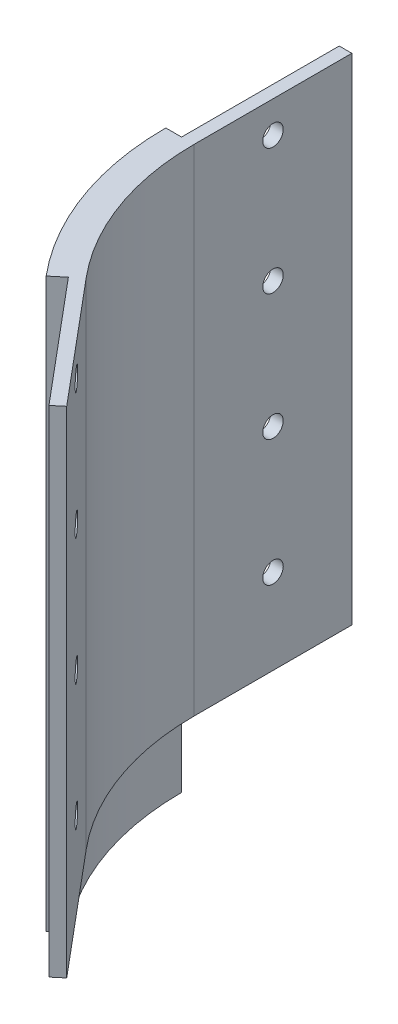
ISO-10303-21;
HEADER;
FILE_DESCRIPTION(('STEP AP214'),'2;1');
FILE_NAME('part.step','',(''),(''),'','','');
FILE_SCHEMA(('AUTOMOTIVE_DESIGN { 1 0 10303 214 1 1 1 1 }'));
ENDSEC;
DATA;
#1=APPLICATION_CONTEXT('core data for automotive mechanical design processes');
#2=APPLICATION_PROTOCOL_DEFINITION('international standard','automotive_design',2000,#1);
#3=PRODUCT_CONTEXT('',#1,'mechanical');
#4=PRODUCT('Part','Part','',(#3));
#5=PRODUCT_RELATED_PRODUCT_CATEGORY('part','',(#4));
#6=PRODUCT_DEFINITION_FORMATION('','',#4);
#7=PRODUCT_DEFINITION_CONTEXT('part definition',#1,'design');
#8=PRODUCT_DEFINITION('design','',#6,#7);
#9=PRODUCT_DEFINITION_SHAPE('','',#8);
#10=(LENGTH_UNIT() NAMED_UNIT(*) SI_UNIT(.MILLI.,.METRE.));
#11=(NAMED_UNIT(*) PLANE_ANGLE_UNIT() SI_UNIT($,.RADIAN.));
#12=(NAMED_UNIT(*) SI_UNIT($,.STERADIAN.) SOLID_ANGLE_UNIT());
#13=UNCERTAINTY_MEASURE_WITH_UNIT(LENGTH_MEASURE(1.E-05),#10,'distance_accuracy_value','');
#14=(GEOMETRIC_REPRESENTATION_CONTEXT(3) GLOBAL_UNCERTAINTY_ASSIGNED_CONTEXT((#13)) GLOBAL_UNIT_ASSIGNED_CONTEXT((#10,
#11,#12)) REPRESENTATION_CONTEXT('',''));
#15=CARTESIAN_POINT('',(0.,0.,0.));
#16=DIRECTION('',(0.,0.,1.));
#17=DIRECTION('',(1.,0.,0.));
#18=AXIS2_PLACEMENT_3D('',#15,#16,#17);
#19=CARTESIAN_POINT('',(6.70784506652562,200.,59.6418141452981));
#20=DIRECTION('',(-0.64278760968654,0.,-0.766044443118977));
#21=DIRECTION('',(0.766044443118978,0.,-0.64278760968654));
#22=AXIS2_PLACEMENT_3D('',#19,#20,#21);
#23=PLANE('',#22);
#24=DIRECTION('',(-0.766044443118977,0.,0.64278760968654));
#25=VECTOR('',#24,1.);
#26=CARTESIAN_POINT('',(6.70784506652562,20.,59.6418141452981));
#27=LINE('',#26,#25);
#28=CARTESIAN_POINT('',(10.5380672821205,20.,56.4278760968654));
#29=VERTEX_POINT('',#28);
#30=CARTESIAN_POINT('',(6.70784506652562,20.,59.6418141452981));
#31=VERTEX_POINT('',#30);
#32=EDGE_CURVE('E149',#29,#31,#27,.T.);
#33=ORIENTED_EDGE('',*,*,#32,.F.);
#34=DIRECTION('',(0.,-1.,0.));
#35=VECTOR('',#34,1.);
#36=CARTESIAN_POINT('',(10.5380672821205,43.,56.4278760968654));
#37=LINE('',#36,#35);
#38=CARTESIAN_POINT('',(10.5380672821205,43.0000000000001,56.4278760968654));
#39=VERTEX_POINT('',#38);
#40=EDGE_CURVE('E169',#39,#29,#37,.T.);
#41=ORIENTED_EDGE('',*,*,#40,.F.);
#42=DIRECTION('',(0.,-1.,0.));
#43=VECTOR('',#42,1.);
#44=CARTESIAN_POINT('',(10.5380672821205,200.,56.4278760968654));
#45=LINE('',#44,#43);
#46=CARTESIAN_POINT('',(10.5380672821205,200.,56.4278760968654));
#47=VERTEX_POINT('',#46);
#48=EDGE_CURVE('E11',#47,#39,#45,.T.);
#49=ORIENTED_EDGE('',*,*,#48,.F.);
#50=DIRECTION('',(-0.766044443118977,0.,0.64278760968654));
#51=VECTOR('',#50,1.);
#52=CARTESIAN_POINT('',(6.70784506652562,200.,59.6418141452981));
#53=LINE('',#52,#51);
#54=CARTESIAN_POINT('',(6.70784506652562,200.,59.6418141452981));
#55=VERTEX_POINT('',#54);
#56=EDGE_CURVE('E235',#47,#55,#53,.T.);
#57=ORIENTED_EDGE('',*,*,#56,.T.);
#58=DIRECTION('',(0.,-1.,0.));
#59=VECTOR('',#58,1.);
#60=CARTESIAN_POINT('',(6.70784506652562,200.,59.6418141452981));
#61=LINE('',#60,#59);
#62=EDGE_CURVE('E47',#55,#31,#61,.T.);
#63=ORIENTED_EDGE('',*,*,#62,.T.);
#64=EDGE_LOOP('',(#33,#41,#49,#57,#63));
#65=FACE_BOUND('',#64,.T.);
#66=ADVANCED_FACE('F39',(#65),#23,.F.);
#67=CARTESIAN_POINT('',(77.7861913430201,200.,0.));
#68=DIRECTION('',(0.,-1.,0.));
#69=DIRECTION('',(0.,0.,1.));
#70=AXIS2_PLACEMENT_3D('',#67,#68,#69);
#71=CYLINDRICAL_SURFACE('',#70,92.7861913430201);
#72=CARTESIAN_POINT('',(77.7861913430201,20.,0.));
#73=DIRECTION('',(0.,-1.,0.));
#74=DIRECTION('',(0.,0.,-1.));
#75=AXIS2_PLACEMENT_3D('',#72,#73,#74);
#76=CIRCLE('',#75,92.7861913430201);
#77=CARTESIAN_POINT('',(-15.,20.,0.));
#78=VERTEX_POINT('',#77);
#79=EDGE_CURVE('E247',#31,#78,#76,.T.);
#80=ORIENTED_EDGE('',*,*,#79,.F.);
#81=ORIENTED_EDGE('',*,*,#62,.F.);
#82=CARTESIAN_POINT('',(77.7861913430201,200.,0.));
#83=DIRECTION('',(0.,-1.,0.));
#84=DIRECTION('',(0.,0.,-1.));
#85=AXIS2_PLACEMENT_3D('',#82,#83,#84);
#86=CIRCLE('',#85,92.7861913430201);
#87=CARTESIAN_POINT('',(-15.,200.,0.));
#88=VERTEX_POINT('',#87);
#89=EDGE_CURVE('E238',#55,#88,#86,.T.);
#90=ORIENTED_EDGE('',*,*,#89,.T.);
#91=DIRECTION('',(0.,-1.,0.));
#92=VECTOR('',#91,1.);
#93=CARTESIAN_POINT('',(-15.,200.,0.));
#94=LINE('',#93,#92);
#95=EDGE_CURVE('E253',#88,#78,#94,.T.);
#96=ORIENTED_EDGE('',*,*,#95,.T.);
#97=EDGE_LOOP('',(#80,#81,#90,#96));
#98=FACE_BOUND('',#97,.T.);
#99=ADVANCED_FACE('F300',(#98),#71,.T.);
#100=CARTESIAN_POINT('',(-15.,200.,0.));
#101=DIRECTION('',(0.,0.,1.));
#102=DIRECTION('',(-1.,0.,0.));
#103=AXIS2_PLACEMENT_3D('',#100,#101,#102);
#104=PLANE('',#103);
#105=DIRECTION('',(1.,0.,0.));
#106=VECTOR('',#105,1.);
#107=CARTESIAN_POINT('',(-15.,20.,0.));
#108=LINE('',#107,#106);
#109=CARTESIAN_POINT('',(-9.99999999999999,20.,0.));
#110=VERTEX_POINT('',#109);
#111=EDGE_CURVE('E80',#78,#110,#108,.T.);
#112=ORIENTED_EDGE('',*,*,#111,.F.);
#113=ORIENTED_EDGE('',*,*,#95,.F.);
#114=DIRECTION('',(1.,0.,0.));
#115=VECTOR('',#114,1.);
#116=CARTESIAN_POINT('',(-15.,200.,0.));
#117=LINE('',#116,#115);
#118=CARTESIAN_POINT('',(-9.99999999999999,200.,0.));
#119=VERTEX_POINT('',#118);
#120=EDGE_CURVE('E241',#88,#119,#117,.T.);
#121=ORIENTED_EDGE('',*,*,#120,.T.);
#122=DIRECTION('',(0.,-1.,0.));
#123=VECTOR('',#122,1.);
#124=CARTESIAN_POINT('',(-9.99999999999999,200.,0.));
#125=LINE('',#124,#123);
#126=CARTESIAN_POINT('',(-9.99999999999999,43.,0.));
#127=VERTEX_POINT('',#126);
#128=EDGE_CURVE('E244',#119,#127,#125,.T.);
#129=ORIENTED_EDGE('',*,*,#128,.T.);
#130=DIRECTION('',(0.,-1.,0.));
#131=VECTOR('',#130,1.);
#132=CARTESIAN_POINT('',(-9.99999999999999,43.,0.));
#133=LINE('',#132,#131);
#134=EDGE_CURVE('E172',#127,#110,#133,.T.);
#135=ORIENTED_EDGE('',*,*,#134,.T.);
#136=EDGE_LOOP('',(#112,#113,#121,#129,#135));
#137=FACE_BOUND('',#136,.T.);
#138=ADVANCED_FACE('F297',(#137),#104,.F.);
#139=CARTESIAN_POINT('',(77.7861913430201,200.,0.));
#140=DIRECTION('',(0.,1.,0.));
#141=DIRECTION('',(0.,0.,-1.));
#142=AXIS2_PLACEMENT_3D('',#139,#140,#141);
#143=PLANE('',#142);
#144=ORIENTED_EDGE('',*,*,#120,.F.);
#145=ORIENTED_EDGE('',*,*,#89,.F.);
#146=ORIENTED_EDGE('',*,*,#56,.F.);
#147=DIRECTION('',(-0.642787609686543,0.,-0.766044443118975));
#148=VECTOR('',#147,1.);
#149=CARTESIAN_POINT('',(-21.6013132022066,200.,18.1256539409167));
#150=LINE('',#149,#148);
#151=CARTESIAN_POINT('',(42.6774477664477,200.,94.7300982528141));
#152=VERTEX_POINT('',#151);
#153=EDGE_CURVE('E87',#152,#47,#150,.T.);
#154=ORIENTED_EDGE('',*,*,#153,.F.);
#155=DIRECTION('',(-0.766044443118976,0.,0.642787609686542));
#156=VECTOR('',#155,1.);
#157=CARTESIAN_POINT('',(64.2787609686542,200.,76.6044443118976));
#158=LINE('',#157,#156);
#159=CARTESIAN_POINT('',(45.7416255389236,200.,92.158947814068));
#160=VERTEX_POINT('',#159);
#161=EDGE_CURVE('E148',#160,#152,#158,.T.);
#162=ORIENTED_EDGE('',*,*,#161,.F.);
#163=DIRECTION('',(0.642787609686543,0.,0.766044443118975));
#164=VECTOR('',#163,1.);
#165=CARTESIAN_POINT('',(-18.5371354297307,200.,15.5545035021705));
#166=LINE('',#165,#164);
#167=CARTESIAN_POINT('',(13.6022450545964,200.,53.8567256581192));
#168=VERTEX_POINT('',#167);
#169=EDGE_CURVE('E221',#168,#160,#166,.T.);
#170=ORIENTED_EDGE('',*,*,#169,.F.);
#171=CARTESIAN_POINT('',(77.7861913430201,200.,0.));
#172=DIRECTION('',(0.,-1.,0.));
#173=DIRECTION('',(0.,0.,-1.));
#174=AXIS2_PLACEMENT_3D('',#171,#172,#173);
#175=CIRCLE('',#174,83.7861913430201);
#176=CARTESIAN_POINT('',(-5.99999999999999,200.,0.));
#177=VERTEX_POINT('',#176);
#178=EDGE_CURVE('E218',#168,#177,#175,.T.);
#179=ORIENTED_EDGE('',*,*,#178,.T.);
#180=DIRECTION('',(0.,0.,-1.));
#181=VECTOR('',#180,1.);
#182=CARTESIAN_POINT('',(-5.99999999999999,200.,0.));
#183=LINE('',#182,#181);
#184=CARTESIAN_POINT('',(-6.00000000000002,200.,-50.));
#185=VERTEX_POINT('',#184);
#186=EDGE_CURVE('E215',#177,#185,#183,.T.);
#187=ORIENTED_EDGE('',*,*,#186,.T.);
#188=DIRECTION('',(-1.,0.,0.));
#189=VECTOR('',#188,1.);
#190=CARTESIAN_POINT('',(1.73472347597681E-13,200.,-49.9999999999999));
#191=LINE('',#190,#189);
#192=CARTESIAN_POINT('',(-10.,200.,-50.));
#193=VERTEX_POINT('',#192);
#194=EDGE_CURVE('E213',#185,#193,#191,.T.);
#195=ORIENTED_EDGE('',*,*,#194,.T.);
#196=DIRECTION('',(0.,0.,1.));
#197=VECTOR('',#196,1.);
#198=CARTESIAN_POINT('',(-10.,200.,0.));
#199=LINE('',#198,#197);
#200=EDGE_CURVE('E64',#193,#119,#199,.T.);
#201=ORIENTED_EDGE('',*,*,#200,.T.);
#202=EDGE_LOOP('',(#144,#145,#146,#154,#162,#170,#179,#187,#195,#201));
#203=FACE_BOUND('',#202,.T.);
#204=ADVANCED_FACE('F289',(#203),#143,.T.);
#205=CARTESIAN_POINT('',(77.7861913430201,20.,0.));
#206=DIRECTION('',(0.,1.,0.));
#207=DIRECTION('',(0.,0.,-1.));
#208=AXIS2_PLACEMENT_3D('',#205,#206,#207);
#209=PLANE('',#208);
#210=ORIENTED_EDGE('',*,*,#32,.T.);
#211=ORIENTED_EDGE('',*,*,#79,.T.);
#212=ORIENTED_EDGE('',*,*,#111,.T.);
#213=CARTESIAN_POINT('',(77.7861913430202,20.,0.));
#214=DIRECTION('',(0.,1.,0.));
#215=DIRECTION('',(0.,0.,-1.));
#216=AXIS2_PLACEMENT_3D('',#213,#214,#215);
#217=CIRCLE('',#216,87.7861913430202);
#218=EDGE_CURVE('E170',#110,#29,#217,.T.);
#219=ORIENTED_EDGE('',*,*,#218,.T.);
#220=EDGE_LOOP('',(#210,#211,#212,#219));
#221=FACE_BOUND('',#220,.T.);
#222=ADVANCED_FACE('F305',(#221),#209,.F.);
#223=CARTESIAN_POINT('',(-10.,-135.093295013004,0.));
#224=DIRECTION('',(1.,0.,0.));
#225=DIRECTION('',(0.,0.,1.));
#226=AXIS2_PLACEMENT_3D('',#223,#224,#225);
#227=PLANE('',#226);
#228=CARTESIAN_POINT('',(-10.,190.,-25.));
#229=DIRECTION('',(1.,0.,0.));
#230=DIRECTION('',(0.,0.,-1.));
#231=AXIS2_PLACEMENT_3D('',#228,#229,#230);
#232=CIRCLE('',#231,3.25);
#233=CARTESIAN_POINT('',(-10.,190.,-28.25));
#234=VERTEX_POINT('',#233);
#235=EDGE_CURVE('E200',#234,#234,#232,.T.);
#236=ORIENTED_EDGE('',*,*,#235,.T.);
#237=EDGE_LOOP('',(#236));
#238=FACE_BOUND('',#237,.T.);
#239=CARTESIAN_POINT('',(-10.,150.,-25.));
#240=DIRECTION('',(1.,0.,0.));
#241=DIRECTION('',(0.,0.,-1.));
#242=AXIS2_PLACEMENT_3D('',#239,#240,#241);
#243=CIRCLE('',#242,3.25);
#244=CARTESIAN_POINT('',(-10.,150.,-28.25));
#245=VERTEX_POINT('',#244);
#246=EDGE_CURVE('E204',#245,#245,#243,.T.);
#247=ORIENTED_EDGE('',*,*,#246,.T.);
#248=EDGE_LOOP('',(#247));
#249=FACE_BOUND('',#248,.T.);
#250=CARTESIAN_POINT('',(-10.,110.,-25.));
#251=DIRECTION('',(1.,0.,0.));
#252=DIRECTION('',(0.,0.,-1.));
#253=AXIS2_PLACEMENT_3D('',#250,#251,#252);
#254=CIRCLE('',#253,3.25);
#255=CARTESIAN_POINT('',(-10.,110.,-28.25));
#256=VERTEX_POINT('',#255);
#257=EDGE_CURVE('E207',#256,#256,#254,.T.);
#258=ORIENTED_EDGE('',*,*,#257,.T.);
#259=EDGE_LOOP('',(#258));
#260=FACE_BOUND('',#259,.T.);
#261=CARTESIAN_POINT('',(-10.,70.,-25.));
#262=DIRECTION('',(1.,0.,0.));
#263=DIRECTION('',(0.,0.,-1.));
#264=AXIS2_PLACEMENT_3D('',#261,#262,#263);
#265=CIRCLE('',#264,3.25);
#266=CARTESIAN_POINT('',(-10.,70.,-28.25));
#267=VERTEX_POINT('',#266);
#268=EDGE_CURVE('E199',#267,#267,#265,.T.);
#269=ORIENTED_EDGE('',*,*,#268,.T.);
#270=EDGE_LOOP('',(#269));
#271=FACE_BOUND('',#270,.T.);
#272=ORIENTED_EDGE('',*,*,#128,.F.);
#273=ORIENTED_EDGE('',*,*,#200,.F.);
#274=DIRECTION('',(0.,1.,0.));
#275=VECTOR('',#274,1.);
#276=CARTESIAN_POINT('',(-10.,-135.093295013004,-50.));
#277=LINE('',#276,#275);
#278=CARTESIAN_POINT('',(-10.,43.,-50.));
#279=VERTEX_POINT('',#278);
#280=EDGE_CURVE('E225',#279,#193,#277,.T.);
#281=ORIENTED_EDGE('',*,*,#280,.F.);
#282=DIRECTION('',(0.,0.,1.));
#283=VECTOR('',#282,1.);
#284=CARTESIAN_POINT('',(-10.,43.,-50.));
#285=LINE('',#284,#283);
#286=EDGE_CURVE('E166',#279,#127,#285,.T.);
#287=ORIENTED_EDGE('',*,*,#286,.T.);
#288=EDGE_LOOP('',(#272,#273,#281,#287));
#289=FACE_BOUND('',#288,.T.);
#290=ADVANCED_FACE('F296',(#238,#249,#260,#271,#289),#227,.F.);
#291=CARTESIAN_POINT('',(1.73472347597681E-13,-135.093295013004,-49.9999999999999));
#292=DIRECTION('',(0.,0.,1.));
#293=DIRECTION('',(-1.,0.,0.));
#294=AXIS2_PLACEMENT_3D('',#291,#292,#293);
#295=PLANE('',#294);
#296=ORIENTED_EDGE('',*,*,#280,.T.);
#297=ORIENTED_EDGE('',*,*,#194,.F.);
#298=DIRECTION('',(0.,1.,0.));
#299=VECTOR('',#298,1.);
#300=CARTESIAN_POINT('',(-6.00000000000002,-135.093295013004,-50.));
#301=LINE('',#300,#299);
#302=CARTESIAN_POINT('',(-6.00000000000002,43.,-50.));
#303=VERTEX_POINT('',#302);
#304=EDGE_CURVE('E232',#303,#185,#301,.T.);
#305=ORIENTED_EDGE('',*,*,#304,.F.);
#306=DIRECTION('',(-1.,0.,0.));
#307=VECTOR('',#306,1.);
#308=CARTESIAN_POINT('',(-6.00000000000002,43.,-50.));
#309=LINE('',#308,#307);
#310=EDGE_CURVE('E164',#303,#279,#309,.T.);
#311=ORIENTED_EDGE('',*,*,#310,.T.);
#312=EDGE_LOOP('',(#296,#297,#305,#311));
#313=FACE_BOUND('',#312,.T.);
#314=ADVANCED_FACE('F274',(#313),#295,.F.);
#315=CARTESIAN_POINT('',(-5.99999999999999,-135.093295013004,0.));
#316=DIRECTION('',(-1.,0.,0.));
#317=DIRECTION('',(0.,0.,-1.));
#318=AXIS2_PLACEMENT_3D('',#315,#316,#317);
#319=PLANE('',#318);
#320=CARTESIAN_POINT('',(-6.00000000000001,190.,-25.));
#321=DIRECTION('',(1.,0.,0.));
#322=DIRECTION('',(0.,0.,-1.));
#323=AXIS2_PLACEMENT_3D('',#320,#321,#322);
#324=CIRCLE('',#323,3.25);
#325=CARTESIAN_POINT('',(-6.00000000000001,190.,-28.25));
#326=VERTEX_POINT('',#325);
#327=EDGE_CURVE('E42',#326,#326,#324,.T.);
#328=ORIENTED_EDGE('',*,*,#327,.F.);
#329=EDGE_LOOP('',(#328));
#330=FACE_BOUND('',#329,.T.);
#331=CARTESIAN_POINT('',(-6.00000000000001,150.,-25.));
#332=DIRECTION('',(1.,0.,0.));
#333=DIRECTION('',(0.,0.,-1.));
#334=AXIS2_PLACEMENT_3D('',#331,#332,#333);
#335=CIRCLE('',#334,3.25);
#336=CARTESIAN_POINT('',(-6.00000000000001,150.,-28.25));
#337=VERTEX_POINT('',#336);
#338=EDGE_CURVE('E261',#337,#337,#335,.T.);
#339=ORIENTED_EDGE('',*,*,#338,.F.);
#340=EDGE_LOOP('',(#339));
#341=FACE_BOUND('',#340,.T.);
#342=CARTESIAN_POINT('',(-6.00000000000001,110.,-25.));
#343=DIRECTION('',(1.,0.,0.));
#344=DIRECTION('',(0.,0.,-1.));
#345=AXIS2_PLACEMENT_3D('',#342,#343,#344);
#346=CIRCLE('',#345,3.25);
#347=CARTESIAN_POINT('',(-6.00000000000001,110.,-28.25));
#348=VERTEX_POINT('',#347);
#349=EDGE_CURVE('E259',#348,#348,#346,.T.);
#350=ORIENTED_EDGE('',*,*,#349,.F.);
#351=EDGE_LOOP('',(#350));
#352=FACE_BOUND('',#351,.T.);
#353=CARTESIAN_POINT('',(-6.00000000000001,70.,-25.));
#354=DIRECTION('',(1.,0.,0.));
#355=DIRECTION('',(0.,0.,-1.));
#356=AXIS2_PLACEMENT_3D('',#353,#354,#355);
#357=CIRCLE('',#356,3.25);
#358=CARTESIAN_POINT('',(-6.00000000000001,70.,-28.25));
#359=VERTEX_POINT('',#358);
#360=EDGE_CURVE('E203',#359,#359,#357,.T.);
#361=ORIENTED_EDGE('',*,*,#360,.F.);
#362=EDGE_LOOP('',(#361));
#363=FACE_BOUND('',#362,.T.);
#364=ORIENTED_EDGE('',*,*,#304,.T.);
#365=ORIENTED_EDGE('',*,*,#186,.F.);
#366=DIRECTION('',(0.,1.,0.));
#367=VECTOR('',#366,1.);
#368=CARTESIAN_POINT('',(-5.99999999999999,-135.093295013004,0.));
#369=LINE('',#368,#367);
#370=CARTESIAN_POINT('',(-5.99999999999999,43.,0.));
#371=VERTEX_POINT('',#370);
#372=EDGE_CURVE('E230',#371,#177,#369,.T.);
#373=ORIENTED_EDGE('',*,*,#372,.F.);
#374=DIRECTION('',(0.,0.,-1.));
#375=VECTOR('',#374,1.);
#376=CARTESIAN_POINT('',(-5.99999999999999,43.,0.));
#377=LINE('',#376,#375);
#378=EDGE_CURVE('E162',#371,#303,#377,.T.);
#379=ORIENTED_EDGE('',*,*,#378,.T.);
#380=EDGE_LOOP('',(#364,#365,#373,#379));
#381=FACE_BOUND('',#380,.T.);
#382=ADVANCED_FACE('F270',(#330,#341,#352,#363,#381),#319,.F.);
#383=CARTESIAN_POINT('',(77.7861913430201,-135.093295013004,0.));
#384=DIRECTION('',(0.,1.,0.));
#385=DIRECTION('',(0.,0.,-1.));
#386=AXIS2_PLACEMENT_3D('',#383,#384,#385);
#387=CYLINDRICAL_SURFACE('',#386,83.7861913430201);
#388=ORIENTED_EDGE('',*,*,#372,.T.);
#389=ORIENTED_EDGE('',*,*,#178,.F.);
#390=DIRECTION('',(0.,1.,0.));
#391=VECTOR('',#390,1.);
#392=CARTESIAN_POINT('',(13.6022450545964,-135.093295013004,53.8567256581192));
#393=LINE('',#392,#391);
#394=CARTESIAN_POINT('',(13.6022450545964,43.,53.8567256581192));
#395=VERTEX_POINT('',#394);
#396=EDGE_CURVE('E228',#395,#168,#393,.T.);
#397=ORIENTED_EDGE('',*,*,#396,.F.);
#398=CARTESIAN_POINT('',(77.7861913430201,43.,0.));
#399=DIRECTION('',(0.,-1.,0.));
#400=DIRECTION('',(0.,0.,1.));
#401=AXIS2_PLACEMENT_3D('',#398,#399,#400);
#402=CIRCLE('',#401,83.7861913430201);
#403=EDGE_CURVE('E157',#395,#371,#402,.T.);
#404=ORIENTED_EDGE('',*,*,#403,.T.);
#405=EDGE_LOOP('',(#388,#389,#397,#404));
#406=FACE_BOUND('',#405,.T.);
#407=ADVANCED_FACE('F273',(#406),#387,.F.);
#408=CARTESIAN_POINT('',(-18.5371354297307,-135.093295013004,15.5545035021705));
#409=DIRECTION('',(0.766044443118975,0.,-0.642787609686543));
#410=DIRECTION('',(0.642787609686543,0.,0.766044443118975));
#411=AXIS2_PLACEMENT_3D('',#408,#409,#410);
#412=PLANE('',#411);
#413=DIRECTION('',(-0.642787609686543,0.,-0.766044443118975));
#414=VECTOR('',#413,1.);
#415=CARTESIAN_POINT('',(45.7416255389236,43.,92.158947814068));
#416=LINE('',#415,#414);
#417=CARTESIAN_POINT('',(45.7416255389236,43.,92.158947814068));
#418=VERTEX_POINT('',#417);
#419=EDGE_CURVE('E155',#418,#395,#416,.T.);
#420=ORIENTED_EDGE('',*,*,#419,.T.);
#421=ORIENTED_EDGE('',*,*,#396,.T.);
#422=ORIENTED_EDGE('',*,*,#169,.T.);
#423=DIRECTION('',(0.,1.,0.));
#424=VECTOR('',#423,1.);
#425=CARTESIAN_POINT('',(45.7416255389236,-135.093295013004,92.158947814068));
#426=LINE('',#425,#424);
#427=EDGE_CURVE('E150',#418,#160,#426,.T.);
#428=ORIENTED_EDGE('',*,*,#427,.F.);
#429=EDGE_LOOP('',(#420,#421,#422,#428));
#430=FACE_BOUND('',#429,.T.);
#431=CARTESIAN_POINT('',(29.67193529676,190.,73.0078367360937));
#432=DIRECTION('',(-0.766044443118975,0.,0.642787609686543));
#433=DIRECTION('',(0.642787609686543,0.,0.766044443118975));
#434=AXIS2_PLACEMENT_3D('',#431,#432,#433);
#435=CIRCLE('',#434,3.25);
#436=CARTESIAN_POINT('',(31.7609950282413,190.,75.4974811762303));
#437=VERTEX_POINT('',#436);
#438=EDGE_CURVE('E196',#437,#437,#435,.F.);
#439=ORIENTED_EDGE('',*,*,#438,.F.);
#440=EDGE_LOOP('',(#439));
#441=FACE_BOUND('',#440,.T.);
#442=CARTESIAN_POINT('',(29.67193529676,150.,73.0078367360937));
#443=DIRECTION('',(-0.766044443118975,0.,0.642787609686543));
#444=DIRECTION('',(0.642787609686543,0.,0.766044443118975));
#445=AXIS2_PLACEMENT_3D('',#442,#443,#444);
#446=CIRCLE('',#445,3.25);
#447=CARTESIAN_POINT('',(31.7609950282413,150.,75.4974811762303));
#448=VERTEX_POINT('',#447);
#449=EDGE_CURVE('E193',#448,#448,#446,.F.);
#450=ORIENTED_EDGE('',*,*,#449,.F.);
#451=EDGE_LOOP('',(#450));
#452=FACE_BOUND('',#451,.T.);
#453=CARTESIAN_POINT('',(29.67193529676,110.,73.0078367360937));
#454=DIRECTION('',(-0.766044443118975,0.,0.642787609686543));
#455=DIRECTION('',(0.642787609686543,0.,0.766044443118975));
#456=AXIS2_PLACEMENT_3D('',#453,#454,#455);
#457=CIRCLE('',#456,3.25);
#458=CARTESIAN_POINT('',(31.7609950282413,110.,75.4974811762303));
#459=VERTEX_POINT('',#458);
#460=EDGE_CURVE('E190',#459,#459,#457,.F.);
#461=ORIENTED_EDGE('',*,*,#460,.F.);
#462=EDGE_LOOP('',(#461));
#463=FACE_BOUND('',#462,.T.);
#464=CARTESIAN_POINT('',(29.67193529676,70.,73.0078367360937));
#465=DIRECTION('',(-0.766044443118975,0.,0.642787609686543));
#466=DIRECTION('',(0.642787609686543,0.,0.766044443118975));
#467=AXIS2_PLACEMENT_3D('',#464,#465,#466);
#468=CIRCLE('',#467,3.25);
#469=CARTESIAN_POINT('',(31.7609950282413,70.,75.4974811762303));
#470=VERTEX_POINT('',#469);
#471=EDGE_CURVE('E179',#470,#470,#468,.F.);
#472=ORIENTED_EDGE('',*,*,#471,.F.);
#473=EDGE_LOOP('',(#472));
#474=FACE_BOUND('',#473,.T.);
#475=ADVANCED_FACE('F364',(#430,#441,#452,#463,#474),#412,.T.);
#476=CARTESIAN_POINT('',(64.2787609686542,-135.093295013004,76.6044443118976));
#477=DIRECTION('',(0.642787609686542,0.,0.766044443118976));
#478=DIRECTION('',(-0.766044443118976,0.,0.642787609686542));
#479=AXIS2_PLACEMENT_3D('',#476,#477,#478);
#480=PLANE('',#479);
#481=DIRECTION('',(0.76604444311898,0.,-0.642787609686536));
#482=VECTOR('',#481,1.);
#483=CARTESIAN_POINT('',(42.6774477664477,43.,94.7300982528141));
#484=LINE('',#483,#482);
#485=CARTESIAN_POINT('',(42.6774477664477,43.,94.7300982528141));
#486=VERTEX_POINT('',#485);
#487=EDGE_CURVE('E142',#486,#418,#484,.T.);
#488=ORIENTED_EDGE('',*,*,#487,.T.);
#489=ORIENTED_EDGE('',*,*,#427,.T.);
#490=ORIENTED_EDGE('',*,*,#161,.T.);
#491=DIRECTION('',(0.,1.,0.));
#492=VECTOR('',#491,1.);
#493=CARTESIAN_POINT('',(42.6774477664477,-135.093295013004,94.7300982528141));
#494=LINE('',#493,#492);
#495=EDGE_CURVE('E136',#486,#152,#494,.T.);
#496=ORIENTED_EDGE('',*,*,#495,.F.);
#497=EDGE_LOOP('',(#488,#489,#490,#496));
#498=FACE_BOUND('',#497,.T.);
#499=ADVANCED_FACE('F145',(#498),#480,.T.);
#500=CARTESIAN_POINT('',(-21.6013132022066,-135.093295013004,18.1256539409167));
#501=DIRECTION('',(-0.766044443118975,0.,0.642787609686543));
#502=DIRECTION('',(-0.642787609686543,0.,-0.766044443118975));
#503=AXIS2_PLACEMENT_3D('',#500,#501,#502);
#504=PLANE('',#503);
#505=DIRECTION('',(0.642787609686544,0.,0.766044443118974));
#506=VECTOR('',#505,1.);
#507=CARTESIAN_POINT('',(10.5380672821205,43.,56.4278760968654));
#508=LINE('',#507,#506);
#509=EDGE_CURVE('E132',#39,#486,#508,.T.);
#510=ORIENTED_EDGE('',*,*,#509,.T.);
#511=ORIENTED_EDGE('',*,*,#495,.T.);
#512=ORIENTED_EDGE('',*,*,#153,.T.);
#513=ORIENTED_EDGE('',*,*,#48,.T.);
#514=EDGE_LOOP('',(#510,#511,#512,#513));
#515=FACE_BOUND('',#514,.T.);
#516=CARTESIAN_POINT('',(26.6077575242839,190.,75.57898717484));
#517=DIRECTION('',(-0.766044443118978,0.,0.642787609686539));
#518=DIRECTION('',(0.642787609686539,0.,0.766044443118978));
#519=AXIS2_PLACEMENT_3D('',#516,#517,#518);
#520=CIRCLE('',#519,3.25);
#521=CARTESIAN_POINT('',(28.6968172557651,190.,78.0686316149767));
#522=VERTEX_POINT('',#521);
#523=EDGE_CURVE('E176',#522,#522,#520,.T.);
#524=ORIENTED_EDGE('',*,*,#523,.F.);
#525=EDGE_LOOP('',(#524));
#526=FACE_BOUND('',#525,.T.);
#527=CARTESIAN_POINT('',(26.6077575242839,150.,75.57898717484));
#528=DIRECTION('',(-0.766044443118978,0.,0.642787609686539));
#529=DIRECTION('',(0.642787609686539,0.,0.766044443118978));
#530=AXIS2_PLACEMENT_3D('',#527,#528,#529);
#531=CIRCLE('',#530,3.25);
#532=CARTESIAN_POINT('',(28.6968172557651,150.,78.0686316149767));
#533=VERTEX_POINT('',#532);
#534=EDGE_CURVE('E180',#533,#533,#531,.T.);
#535=ORIENTED_EDGE('',*,*,#534,.F.);
#536=EDGE_LOOP('',(#535));
#537=FACE_BOUND('',#536,.T.);
#538=CARTESIAN_POINT('',(26.6077575242839,110.,75.57898717484));
#539=DIRECTION('',(-0.766044443118978,0.,0.642787609686539));
#540=DIRECTION('',(0.642787609686539,0.,0.766044443118978));
#541=AXIS2_PLACEMENT_3D('',#538,#539,#540);
#542=CIRCLE('',#541,3.25);
#543=CARTESIAN_POINT('',(28.6968172557651,110.,78.0686316149767));
#544=VERTEX_POINT('',#543);
#545=EDGE_CURVE('E183',#544,#544,#542,.T.);
#546=ORIENTED_EDGE('',*,*,#545,.F.);
#547=EDGE_LOOP('',(#546));
#548=FACE_BOUND('',#547,.T.);
#549=CARTESIAN_POINT('',(26.6077575242839,70.,75.57898717484));
#550=DIRECTION('',(-0.766044443118978,0.,0.642787609686539));
#551=DIRECTION('',(0.642787609686539,0.,0.766044443118978));
#552=AXIS2_PLACEMENT_3D('',#549,#550,#551);
#553=CIRCLE('',#552,3.25);
#554=CARTESIAN_POINT('',(28.6968172557651,70.,78.0686316149767));
#555=VERTEX_POINT('',#554);
#556=EDGE_CURVE('E174',#555,#555,#553,.T.);
#557=ORIENTED_EDGE('',*,*,#556,.F.);
#558=EDGE_LOOP('',(#557));
#559=FACE_BOUND('',#558,.T.);
#560=ADVANCED_FACE('F134',(#515,#526,#537,#548,#559),#504,.T.);
#561=CARTESIAN_POINT('',(45.7416255389236,70.,-25.));
#562=DIRECTION('',(-1.,0.,0.));
#563=DIRECTION('',(0.,0.,-1.));
#564=AXIS2_PLACEMENT_3D('',#561,#562,#563);
#565=CYLINDRICAL_SURFACE('',#564,3.25);
#566=ORIENTED_EDGE('',*,*,#268,.F.);
#567=EDGE_LOOP('',(#566));
#568=FACE_BOUND('',#567,.T.);
#569=ORIENTED_EDGE('',*,*,#360,.T.);
#570=EDGE_LOOP('',(#569));
#571=FACE_BOUND('',#570,.T.);
#572=ADVANCED_FACE('F390',(#568,#571),#565,.F.);
#573=CARTESIAN_POINT('',(45.7416255389236,110.,-25.));
#574=DIRECTION('',(-1.,0.,0.));
#575=DIRECTION('',(0.,0.,-1.));
#576=AXIS2_PLACEMENT_3D('',#573,#574,#575);
#577=CYLINDRICAL_SURFACE('',#576,3.25);
#578=ORIENTED_EDGE('',*,*,#257,.F.);
#579=EDGE_LOOP('',(#578));
#580=FACE_BOUND('',#579,.T.);
#581=ORIENTED_EDGE('',*,*,#349,.T.);
#582=EDGE_LOOP('',(#581));
#583=FACE_BOUND('',#582,.T.);
#584=ADVANCED_FACE('F399',(#580,#583),#577,.F.);
#585=CARTESIAN_POINT('',(45.7416255389236,150.,-25.));
#586=DIRECTION('',(-1.,0.,0.));
#587=DIRECTION('',(0.,0.,-1.));
#588=AXIS2_PLACEMENT_3D('',#585,#586,#587);
#589=CYLINDRICAL_SURFACE('',#588,3.25);
#590=ORIENTED_EDGE('',*,*,#246,.F.);
#591=EDGE_LOOP('',(#590));
#592=FACE_BOUND('',#591,.T.);
#593=ORIENTED_EDGE('',*,*,#338,.T.);
#594=EDGE_LOOP('',(#593));
#595=FACE_BOUND('',#594,.T.);
#596=ADVANCED_FACE('F409',(#592,#595),#589,.F.);
#597=CARTESIAN_POINT('',(45.7416255389236,190.,-25.));
#598=DIRECTION('',(-1.,0.,0.));
#599=DIRECTION('',(0.,0.,-1.));
#600=AXIS2_PLACEMENT_3D('',#597,#598,#599);
#601=CYLINDRICAL_SURFACE('',#600,3.25);
#602=ORIENTED_EDGE('',*,*,#235,.F.);
#603=EDGE_LOOP('',(#602));
#604=FACE_BOUND('',#603,.T.);
#605=ORIENTED_EDGE('',*,*,#327,.T.);
#606=EDGE_LOOP('',(#605));
#607=FACE_BOUND('',#606,.T.);
#608=ADVANCED_FACE('F268',(#604,#607),#601,.F.);
#609=CARTESIAN_POINT('',(99.6715522804361,70.,14.2711839425401));
#610=DIRECTION('',(-0.766044443118978,0.,0.642787609686539));
#611=DIRECTION('',(-0.642787609686539,0.,-0.766044443118978));
#612=AXIS2_PLACEMENT_3D('',#609,#610,#611);
#613=CYLINDRICAL_SURFACE('',#612,3.25);
#614=ORIENTED_EDGE('',*,*,#471,.T.);
#615=EDGE_LOOP('',(#614));
#616=FACE_BOUND('',#615,.T.);
#617=ORIENTED_EDGE('',*,*,#556,.T.);
#618=EDGE_LOOP('',(#617));
#619=FACE_BOUND('',#618,.T.);
#620=ADVANCED_FACE('F428',(#616,#619),#613,.F.);
#621=CARTESIAN_POINT('',(99.6715522804361,110.,14.2711839425401));
#622=DIRECTION('',(-0.766044443118978,0.,0.642787609686539));
#623=DIRECTION('',(-0.642787609686539,0.,-0.766044443118978));
#624=AXIS2_PLACEMENT_3D('',#621,#622,#623);
#625=CYLINDRICAL_SURFACE('',#624,3.25);
#626=ORIENTED_EDGE('',*,*,#460,.T.);
#627=EDGE_LOOP('',(#626));
#628=FACE_BOUND('',#627,.T.);
#629=ORIENTED_EDGE('',*,*,#545,.T.);
#630=EDGE_LOOP('',(#629));
#631=FACE_BOUND('',#630,.T.);
#632=ADVANCED_FACE('F438',(#628,#631),#625,.F.);
#633=CARTESIAN_POINT('',(99.6715522804361,150.,14.2711839425401));
#634=DIRECTION('',(-0.766044443118978,0.,0.642787609686539));
#635=DIRECTION('',(-0.642787609686539,0.,-0.766044443118978));
#636=AXIS2_PLACEMENT_3D('',#633,#634,#635);
#637=CYLINDRICAL_SURFACE('',#636,3.25);
#638=ORIENTED_EDGE('',*,*,#449,.T.);
#639=EDGE_LOOP('',(#638));
#640=FACE_BOUND('',#639,.T.);
#641=ORIENTED_EDGE('',*,*,#534,.T.);
#642=EDGE_LOOP('',(#641));
#643=FACE_BOUND('',#642,.T.);
#644=ADVANCED_FACE('F448',(#640,#643),#637,.F.);
#645=CARTESIAN_POINT('',(99.6715522804361,190.,14.2711839425401));
#646=DIRECTION('',(-0.766044443118978,0.,0.642787609686539));
#647=DIRECTION('',(-0.642787609686539,0.,-0.766044443118978));
#648=AXIS2_PLACEMENT_3D('',#645,#646,#647);
#649=CYLINDRICAL_SURFACE('',#648,3.25);
#650=ORIENTED_EDGE('',*,*,#438,.T.);
#651=EDGE_LOOP('',(#650));
#652=FACE_BOUND('',#651,.T.);
#653=ORIENTED_EDGE('',*,*,#523,.T.);
#654=EDGE_LOOP('',(#653));
#655=FACE_BOUND('',#654,.T.);
#656=ADVANCED_FACE('F458',(#652,#655),#649,.F.);
#657=CARTESIAN_POINT('',(77.7861913430202,43.,0.));
#658=DIRECTION('',(0.,-1.,0.));
#659=DIRECTION('',(0.,0.,1.));
#660=AXIS2_PLACEMENT_3D('',#657,#658,#659);
#661=CYLINDRICAL_SURFACE('',#660,87.7861913430202);
#662=ORIENTED_EDGE('',*,*,#218,.F.);
#663=ORIENTED_EDGE('',*,*,#134,.F.);
#664=CARTESIAN_POINT('',(77.7861913430202,43.,0.));
#665=DIRECTION('',(0.,1.,0.));
#666=DIRECTION('',(0.,0.,-1.));
#667=AXIS2_PLACEMENT_3D('',#664,#665,#666);
#668=CIRCLE('',#667,87.7861913430202);
#669=EDGE_CURVE('E55',#127,#39,#668,.T.);
#670=ORIENTED_EDGE('',*,*,#669,.T.);
#671=ORIENTED_EDGE('',*,*,#40,.T.);
#672=EDGE_LOOP('',(#662,#663,#670,#671));
#673=FACE_BOUND('',#672,.T.);
#674=ADVANCED_FACE('F303',(#673),#661,.F.);
#675=CARTESIAN_POINT('',(77.7861913430202,43.,0.));
#676=DIRECTION('',(0.,1.,0.));
#677=DIRECTION('',(0.,0.,-1.));
#678=AXIS2_PLACEMENT_3D('',#675,#676,#677);
#679=PLANE('',#678);
#680=ORIENTED_EDGE('',*,*,#669,.F.);
#681=ORIENTED_EDGE('',*,*,#286,.F.);
#682=ORIENTED_EDGE('',*,*,#310,.F.);
#683=ORIENTED_EDGE('',*,*,#378,.F.);
#684=ORIENTED_EDGE('',*,*,#403,.F.);
#685=ORIENTED_EDGE('',*,*,#419,.F.);
#686=ORIENTED_EDGE('',*,*,#487,.F.);
#687=ORIENTED_EDGE('',*,*,#509,.F.);
#688=EDGE_LOOP('',(#680,#681,#682,#683,#684,#685,#686,#687));
#689=FACE_BOUND('',#688,.T.);
#690=ADVANCED_FACE('F153',(#689),#679,.F.);
#691=CLOSED_SHELL('',(#66,#99,#138,#204,#222,#290,#314,#382,#407,#475,#499,#560,#572,#584,#596,
#608,#620,#632,#644,#656,#674,#690));
#692=MANIFOLD_SOLID_BREP('B2',#691);
#693=ADVANCED_BREP_SHAPE_REPRESENTATION('',(#18,#692),#14);
#694=SHAPE_DEFINITION_REPRESENTATION(#9,#693);
ENDSEC;
END-ISO-10303-21;
